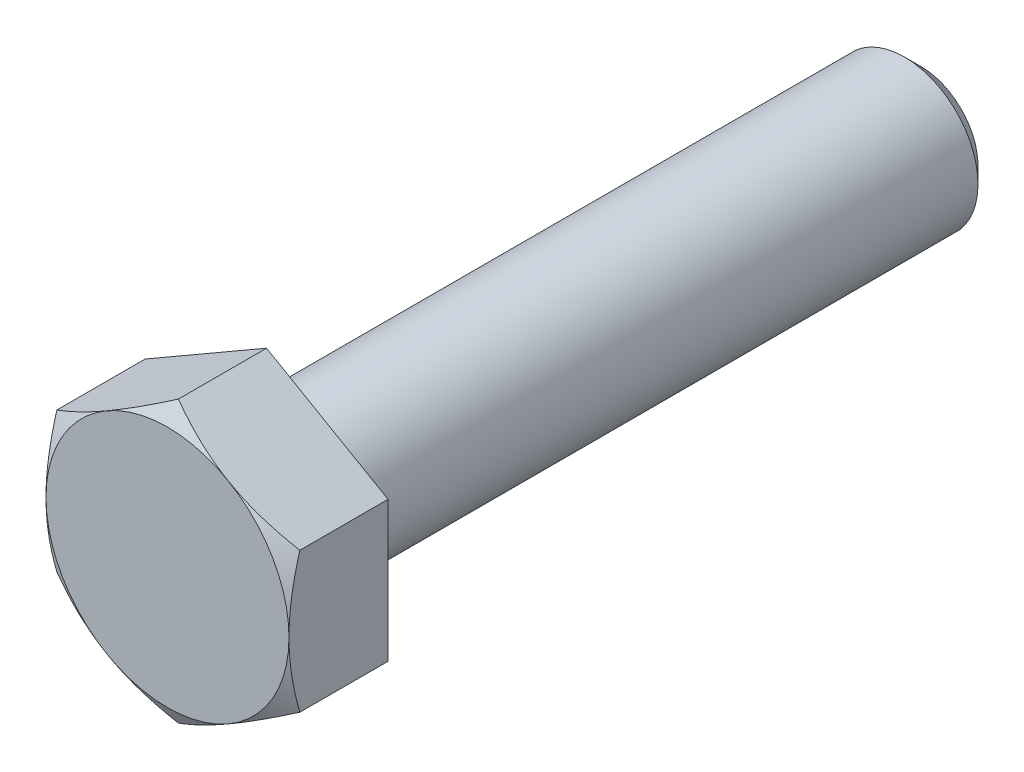
ISO-10303-21;
HEADER;
FILE_DESCRIPTION(('STEP AP214'),'2;1');
FILE_NAME('part.step','',(''),(''),'','','');
FILE_SCHEMA(('AUTOMOTIVE_DESIGN { 1 0 10303 214 1 1 1 1 }'));
ENDSEC;
DATA;
#1=APPLICATION_CONTEXT('core data for automotive mechanical design processes');
#2=APPLICATION_PROTOCOL_DEFINITION('international standard','automotive_design',2000,#1);
#3=PRODUCT_CONTEXT('',#1,'mechanical');
#4=PRODUCT('Part','Part','',(#3));
#5=PRODUCT_RELATED_PRODUCT_CATEGORY('part','',(#4));
#6=PRODUCT_DEFINITION_FORMATION('','',#4);
#7=PRODUCT_DEFINITION_CONTEXT('part definition',#1,'design');
#8=PRODUCT_DEFINITION('design','',#6,#7);
#9=PRODUCT_DEFINITION_SHAPE('','',#8);
#10=(LENGTH_UNIT() NAMED_UNIT(*) SI_UNIT(.MILLI.,.METRE.));
#11=(NAMED_UNIT(*) PLANE_ANGLE_UNIT() SI_UNIT($,.RADIAN.));
#12=(NAMED_UNIT(*) SI_UNIT($,.STERADIAN.) SOLID_ANGLE_UNIT());
#13=UNCERTAINTY_MEASURE_WITH_UNIT(LENGTH_MEASURE(1.E-05),#10,'distance_accuracy_value','');
#14=(GEOMETRIC_REPRESENTATION_CONTEXT(3) GLOBAL_UNCERTAINTY_ASSIGNED_CONTEXT((#13)) GLOBAL_UNIT_ASSIGNED_CONTEXT((#10,
#11,#12)) REPRESENTATION_CONTEXT('',''));
#15=CARTESIAN_POINT('',(0.,0.,0.));
#16=DIRECTION('',(0.,0.,1.));
#17=DIRECTION('',(1.,0.,0.));
#18=AXIS2_PLACEMENT_3D('',#15,#16,#17);
#19=CARTESIAN_POINT('',(-6.5,-3.75277674973257,5.3));
#20=DIRECTION('',(0.,0.,1.));
#21=DIRECTION('',(1.,0.,0.));
#22=AXIS2_PLACEMENT_3D('',#19,#20,#21);
#23=PLANE('',#22);
#24=CARTESIAN_POINT('',(0.,0.,5.3));
#25=DIRECTION('',(0.,0.,1.));
#26=DIRECTION('',(1.,0.,0.));
#27=AXIS2_PLACEMENT_3D('',#24,#25,#26);
#28=CIRCLE('',#27,6.5);
#29=CARTESIAN_POINT('',(3.25,-5.62916512459885,5.3));
#30=VERTEX_POINT('',#29);
#31=CARTESIAN_POINT('',(6.5,0.,5.3));
#32=VERTEX_POINT('',#31);
#33=EDGE_CURVE('E195',#30,#32,#28,.T.);
#34=ORIENTED_EDGE('',*,*,#33,.T.);
#35=CARTESIAN_POINT('',(0.,0.,5.3));
#36=DIRECTION('',(0.,0.,1.));
#37=DIRECTION('',(1.,0.,0.));
#38=AXIS2_PLACEMENT_3D('',#35,#36,#37);
#39=CIRCLE('',#38,6.5);
#40=CARTESIAN_POINT('',(3.25,5.62916512459885,5.3));
#41=VERTEX_POINT('',#40);
#42=EDGE_CURVE('E11',#32,#41,#39,.T.);
#43=ORIENTED_EDGE('',*,*,#42,.T.);
#44=CARTESIAN_POINT('',(0.,0.,5.3));
#45=DIRECTION('',(0.,0.,1.));
#46=DIRECTION('',(1.,0.,0.));
#47=AXIS2_PLACEMENT_3D('',#44,#45,#46);
#48=CIRCLE('',#47,6.5);
#49=CARTESIAN_POINT('',(-3.25,5.62916512459885,5.3));
#50=VERTEX_POINT('',#49);
#51=EDGE_CURVE('E28',#41,#50,#48,.T.);
#52=ORIENTED_EDGE('',*,*,#51,.T.);
#53=CARTESIAN_POINT('',(0.,0.,5.3));
#54=DIRECTION('',(0.,0.,1.));
#55=DIRECTION('',(1.,0.,0.));
#56=AXIS2_PLACEMENT_3D('',#53,#54,#55);
#57=CIRCLE('',#56,6.5);
#58=CARTESIAN_POINT('',(-6.5,0.,5.3));
#59=VERTEX_POINT('',#58);
#60=EDGE_CURVE('E166',#50,#59,#57,.T.);
#61=ORIENTED_EDGE('',*,*,#60,.T.);
#62=CARTESIAN_POINT('',(0.,0.,5.3));
#63=DIRECTION('',(0.,0.,1.));
#64=DIRECTION('',(1.,0.,0.));
#65=AXIS2_PLACEMENT_3D('',#62,#63,#64);
#66=CIRCLE('',#65,6.5);
#67=CARTESIAN_POINT('',(-3.25,-5.62916512459885,5.3));
#68=VERTEX_POINT('',#67);
#69=EDGE_CURVE('E140',#59,#68,#66,.T.);
#70=ORIENTED_EDGE('',*,*,#69,.T.);
#71=CARTESIAN_POINT('',(0.,0.,5.3));
#72=DIRECTION('',(0.,0.,1.));
#73=DIRECTION('',(1.,0.,0.));
#74=AXIS2_PLACEMENT_3D('',#71,#72,#73);
#75=CIRCLE('',#74,6.5);
#76=EDGE_CURVE('E167',#68,#30,#75,.T.);
#77=ORIENTED_EDGE('',*,*,#76,.T.);
#78=EDGE_LOOP('',(#34,#43,#52,#61,#70,#77));
#79=FACE_BOUND('',#78,.T.);
#80=ADVANCED_FACE('F17',(#79),#23,.T.);
#81=CARTESIAN_POINT('',(0.,0.,5.3));
#82=DIRECTION('',(0.,0.,-1.));
#83=DIRECTION('',(1.,0.,0.));
#84=AXIS2_PLACEMENT_3D('',#81,#82,#83);
#85=CONICAL_SURFACE('',#84,6.5,1.0471975511966);
#86=CARTESIAN_POINT('',(6.5,0.,5.30000000000001));
#87=CARTESIAN_POINT('',(6.49999999999998,1.74166975080559,5.30000000000001));
#88=CARTESIAN_POINT('',(6.49999999999999,3.75277674974074,4.71944341639689));
#89=(BOUNDED_CURVE() B_SPLINE_CURVE(2,(#86,#87,#88),.UNSPECIFIED.,.F.,
.F.) B_SPLINE_CURVE_WITH_KNOTS((3,3),(1.73382513864546,2.42154946226623),
.UNSPECIFIED.) CURVE() GEOMETRIC_REPRESENTATION_ITEM() RATIONAL_B_SPLINE_CURVE((1.83937846828339,
1.83937846828338,1.70731703595936)) REPRESENTATION_ITEM(''));
#90=CARTESIAN_POINT('',(6.5,3.75277674973257,4.71944341639925));
#91=VERTEX_POINT('',#90);
#92=EDGE_CURVE('E180',#32,#91,#89,.T.);
#93=ORIENTED_EDGE('',*,*,#92,.T.);
#94=CARTESIAN_POINT('',(6.50000000000708,3.75277674972847,4.71944341639688));
#95=CARTESIAN_POINT('',(4.75833024920054,4.75833024919606,5.3));
#96=CARTESIAN_POINT('',(3.24999999999999,5.62916512459884,5.3));
#97=(BOUNDED_CURVE() B_SPLINE_CURVE(2,(#94,#95,#96),.UNSPECIFIED.,.F.,
.F.) B_SPLINE_CURVE_WITH_KNOTS((3,3),(1.04610081502468,1.73382513864545),
.UNSPECIFIED.) CURVE() GEOMETRIC_REPRESENTATION_ITEM() RATIONAL_B_SPLINE_CURVE((1.70731703595936,
1.83937846828339,1.83937846828339)) REPRESENTATION_ITEM(''));
#98=EDGE_CURVE('E186',#91,#41,#97,.T.);
#99=ORIENTED_EDGE('',*,*,#98,.T.);
#100=ORIENTED_EDGE('',*,*,#42,.F.);
#101=EDGE_LOOP('',(#93,#99,#100));
#102=FACE_BOUND('',#101,.T.);
#103=ADVANCED_FACE('F350',(#102),#85,.T.);
#104=CARTESIAN_POINT('',(0.,0.,5.3));
#105=DIRECTION('',(0.,0.,-1.));
#106=DIRECTION('',(1.,0.,0.));
#107=AXIS2_PLACEMENT_3D('',#104,#105,#106);
#108=CONICAL_SURFACE('',#107,6.5,1.0471975511966);
#109=CARTESIAN_POINT('',(3.24999999999999,5.62916512459884,5.3));
#110=CARTESIAN_POINT('',(1.74166975079944,6.50000000000163,5.3));
#111=CARTESIAN_POINT('',(-7.09578443226996E-12,7.50555349946923,4.71944341639687));
#112=(BOUNDED_CURVE() B_SPLINE_CURVE(2,(#109,#110,#111),.UNSPECIFIED.,.F.,
.F.) B_SPLINE_CURVE_WITH_KNOTS((3,3),(1.73382513864545,2.42154946226623),
.UNSPECIFIED.) CURVE() GEOMETRIC_REPRESENTATION_ITEM() RATIONAL_B_SPLINE_CURVE((1.83937846828338,
1.83937846828339,1.70731703595936)) REPRESENTATION_ITEM(''));
#113=CARTESIAN_POINT('',(0.,7.50555349946513,4.71944341639924));
#114=VERTEX_POINT('',#113);
#115=EDGE_CURVE('E197',#41,#114,#112,.T.);
#116=ORIENTED_EDGE('',*,*,#115,.T.);
#117=CARTESIAN_POINT('',(7.08459972806953E-12,7.50555349946923,4.71944341639687));
#118=CARTESIAN_POINT('',(-1.74166975079946,6.50000000000165,5.3));
#119=CARTESIAN_POINT('',(-3.25000000000001,5.62916512459884,5.29999999999999));
#120=(BOUNDED_CURVE() B_SPLINE_CURVE(2,(#117,#118,#119),.UNSPECIFIED.,.F.,
.F.) B_SPLINE_CURVE_WITH_KNOTS((3,3),(1.04610081502468,1.73382513864545),
.UNSPECIFIED.) CURVE() GEOMETRIC_REPRESENTATION_ITEM() RATIONAL_B_SPLINE_CURVE((1.70731703595936,
1.83937846828338,1.83937846828338)) REPRESENTATION_ITEM(''));
#121=EDGE_CURVE('E196',#114,#50,#120,.T.);
#122=ORIENTED_EDGE('',*,*,#121,.T.);
#123=ORIENTED_EDGE('',*,*,#51,.F.);
#124=EDGE_LOOP('',(#116,#122,#123));
#125=FACE_BOUND('',#124,.T.);
#126=ADVANCED_FACE('F354',(#125),#108,.T.);
#127=CARTESIAN_POINT('',(0.,0.,5.3));
#128=DIRECTION('',(0.,0.,-1.));
#129=DIRECTION('',(1.,0.,0.));
#130=AXIS2_PLACEMENT_3D('',#127,#128,#129);
#131=CONICAL_SURFACE('',#130,6.5,1.0471975511966);
#132=CARTESIAN_POINT('',(-6.50000000000002,3.75277674974076,4.71944341639685));
#133=CARTESIAN_POINT('',(-6.50000000000002,1.74166975080558,5.29999999999998));
#134=CARTESIAN_POINT('',(-6.50000000000002,0.,5.29999999999998));
#135=(BOUNDED_CURVE() B_SPLINE_CURVE(2,(#132,#133,#134),.UNSPECIFIED.,.F.,
.F.) B_SPLINE_CURVE_WITH_KNOTS((3,3),(1.04610081502468,1.73382513864546),
.UNSPECIFIED.) CURVE() GEOMETRIC_REPRESENTATION_ITEM() RATIONAL_B_SPLINE_CURVE((1.70731703595935,
1.83937846828338,1.83937846828338)) REPRESENTATION_ITEM(''));
#136=CARTESIAN_POINT('',(-6.5,3.75277674973256,4.71944341639923));
#137=VERTEX_POINT('',#136);
#138=EDGE_CURVE('E155',#137,#59,#135,.T.);
#139=ORIENTED_EDGE('',*,*,#138,.T.);
#140=ORIENTED_EDGE('',*,*,#60,.F.);
#141=CARTESIAN_POINT('',(-3.25000000000001,5.62916512459884,5.29999999999999));
#142=CARTESIAN_POINT('',(-4.75833024920056,4.75833024919605,5.29999999999999));
#143=CARTESIAN_POINT('',(-6.50000000000711,3.75277674972847,4.71944341639686));
#144=(BOUNDED_CURVE() B_SPLINE_CURVE(2,(#141,#142,#143),.UNSPECIFIED.,.F.,
.F.) B_SPLINE_CURVE_WITH_KNOTS((3,3),(1.73382513864545,2.42154946226623),
.UNSPECIFIED.) CURVE() GEOMETRIC_REPRESENTATION_ITEM() RATIONAL_B_SPLINE_CURVE((1.83937846828338,
1.83937846828338,1.70731703595936)) REPRESENTATION_ITEM(''));
#145=EDGE_CURVE('E99',#50,#137,#144,.T.);
#146=ORIENTED_EDGE('',*,*,#145,.T.);
#147=EDGE_LOOP('',(#139,#140,#146));
#148=FACE_BOUND('',#147,.T.);
#149=ADVANCED_FACE('F365',(#148),#131,.T.);
#150=CARTESIAN_POINT('',(0.,0.,5.3));
#151=DIRECTION('',(0.,0.,-1.));
#152=DIRECTION('',(1.,0.,0.));
#153=AXIS2_PLACEMENT_3D('',#150,#151,#152);
#154=CONICAL_SURFACE('',#153,6.5,1.0471975511966);
#155=CARTESIAN_POINT('',(-6.50000000000002,0.,5.29999999999998));
#156=CARTESIAN_POINT('',(-6.50000000000002,-1.74166975080559,5.29999999999998));
#157=CARTESIAN_POINT('',(-6.50000000000002,-3.75277674974076,4.71944341639686));
#158=(BOUNDED_CURVE() B_SPLINE_CURVE(2,(#155,#156,#157),.UNSPECIFIED.,.F.,
.F.) B_SPLINE_CURVE_WITH_KNOTS((3,3),(1.73382513864546,2.42154946226623),
.UNSPECIFIED.) CURVE() GEOMETRIC_REPRESENTATION_ITEM() RATIONAL_B_SPLINE_CURVE((1.83937846828338,
1.83937846828338,1.70731703595935)) REPRESENTATION_ITEM(''));
#159=CARTESIAN_POINT('',(-6.5,-3.75277674973257,4.71944341639922));
#160=VERTEX_POINT('',#159);
#161=EDGE_CURVE('E136',#59,#160,#158,.T.);
#162=ORIENTED_EDGE('',*,*,#161,.T.);
#163=CARTESIAN_POINT('',(-6.50000000000711,-3.75277674972847,4.71944341639686));
#164=CARTESIAN_POINT('',(-4.75833024920057,-4.75833024919606,5.29999999999999));
#165=CARTESIAN_POINT('',(-3.25000000000001,-5.62916512459884,5.29999999999999));
#166=(BOUNDED_CURVE() B_SPLINE_CURVE(2,(#163,#164,#165),.UNSPECIFIED.,.F.,
.F.) B_SPLINE_CURVE_WITH_KNOTS((3,3),(1.04610081502468,1.73382513864545),
.UNSPECIFIED.) CURVE() GEOMETRIC_REPRESENTATION_ITEM() RATIONAL_B_SPLINE_CURVE((1.70731703595936,
1.83937846828338,1.83937846828338)) REPRESENTATION_ITEM(''));
#167=EDGE_CURVE('E126',#160,#68,#166,.T.);
#168=ORIENTED_EDGE('',*,*,#167,.T.);
#169=ORIENTED_EDGE('',*,*,#69,.F.);
#170=EDGE_LOOP('',(#162,#168,#169));
#171=FACE_BOUND('',#170,.T.);
#172=ADVANCED_FACE('F139',(#171),#154,.T.);
#173=CARTESIAN_POINT('',(0.,0.,5.3));
#174=DIRECTION('',(0.,0.,-1.));
#175=DIRECTION('',(1.,0.,0.));
#176=AXIS2_PLACEMENT_3D('',#173,#174,#175);
#177=CONICAL_SURFACE('',#176,6.5,1.0471975511966);
#178=CARTESIAN_POINT('',(-3.25000000000001,-5.62916512459884,5.29999999999999));
#179=CARTESIAN_POINT('',(-1.74166975079946,-6.50000000000163,5.3));
#180=CARTESIAN_POINT('',(7.07731666486926E-12,-7.50555349946923,4.71944341639687));
#181=(BOUNDED_CURVE() B_SPLINE_CURVE(2,(#178,#179,#180),.UNSPECIFIED.,.F.,
.F.) B_SPLINE_CURVE_WITH_KNOTS((3,3),(1.73382513864545,2.42154946226623),
.UNSPECIFIED.) CURVE() GEOMETRIC_REPRESENTATION_ITEM() RATIONAL_B_SPLINE_CURVE((1.83937846828338,
1.83937846828339,1.70731703595936)) REPRESENTATION_ITEM(''));
#182=CARTESIAN_POINT('',(0.,-7.50555349946514,4.71944341639924));
#183=VERTEX_POINT('',#182);
#184=EDGE_CURVE('E132',#68,#183,#181,.T.);
#185=ORIENTED_EDGE('',*,*,#184,.T.);
#186=CARTESIAN_POINT('',(-7.10358771427027E-12,-7.50555349946924,4.71944341639687));
#187=CARTESIAN_POINT('',(1.74166975079945,-6.50000000000163,5.3));
#188=CARTESIAN_POINT('',(3.25000000000001,-5.62916512459884,5.3));
#189=(BOUNDED_CURVE() B_SPLINE_CURVE(2,(#186,#187,#188),.UNSPECIFIED.,.F.,
.F.) B_SPLINE_CURVE_WITH_KNOTS((3,3),(1.04610081502468,1.73382513864546),
.UNSPECIFIED.) CURVE() GEOMETRIC_REPRESENTATION_ITEM() RATIONAL_B_SPLINE_CURVE((1.70731703595936,
1.83937846828339,1.83937846828339)) REPRESENTATION_ITEM(''));
#190=EDGE_CURVE('E226',#183,#30,#189,.T.);
#191=ORIENTED_EDGE('',*,*,#190,.T.);
#192=ORIENTED_EDGE('',*,*,#76,.F.);
#193=EDGE_LOOP('',(#185,#191,#192));
#194=FACE_BOUND('',#193,.T.);
#195=ADVANCED_FACE('F346',(#194),#177,.T.);
#196=CARTESIAN_POINT('',(0.,0.,5.3));
#197=DIRECTION('',(0.,0.,-1.));
#198=DIRECTION('',(1.,0.,0.));
#199=AXIS2_PLACEMENT_3D('',#196,#197,#198);
#200=CONICAL_SURFACE('',#199,6.5,1.0471975511966);
#201=CARTESIAN_POINT('',(3.25000000000001,-5.62916512459884,5.3));
#202=CARTESIAN_POINT('',(4.75833024920049,-4.75833024919609,5.3));
#203=CARTESIAN_POINT('',(6.50000000000693,-3.75277674972857,4.71944341639693));
#204=(BOUNDED_CURVE() B_SPLINE_CURVE(2,(#201,#202,#203),.UNSPECIFIED.,.F.,
.F.) B_SPLINE_CURVE_WITH_KNOTS((3,3),(1.73382513864546,2.4215494622662),
.UNSPECIFIED.) CURVE() GEOMETRIC_REPRESENTATION_ITEM() RATIONAL_B_SPLINE_CURVE((1.83937846828339,
1.83937846828338,1.70731703595937)) REPRESENTATION_ITEM(''));
#205=CARTESIAN_POINT('',(6.5,-3.75277674973285,4.71944341639943));
#206=VERTEX_POINT('',#205);
#207=EDGE_CURVE('E225',#30,#206,#204,.T.);
#208=ORIENTED_EDGE('',*,*,#207,.T.);
#209=CARTESIAN_POINT('',(6.49999999999999,-3.75277674974098,4.71944341639682));
#210=CARTESIAN_POINT('',(6.49999999999999,-1.74166975080567,5.30000000000001));
#211=CARTESIAN_POINT('',(6.5,0.,5.30000000000001));
#212=(BOUNDED_CURVE() B_SPLINE_CURVE(2,(#209,#210,#211),.UNSPECIFIED.,.F.,
.F.) B_SPLINE_CURVE_WITH_KNOTS((3,3),(1.04610081502464,1.73382513864546),
.UNSPECIFIED.) CURVE() GEOMETRIC_REPRESENTATION_ITEM() RATIONAL_B_SPLINE_CURVE((1.70731703595934,
1.83937846828339,1.83937846828339)) REPRESENTATION_ITEM(''));
#213=EDGE_CURVE('E242',#206,#32,#212,.T.);
#214=ORIENTED_EDGE('',*,*,#213,.T.);
#215=ORIENTED_EDGE('',*,*,#33,.F.);
#216=EDGE_LOOP('',(#208,#214,#215));
#217=FACE_BOUND('',#216,.T.);
#218=ADVANCED_FACE('F336',(#217),#200,.T.);
#219=CARTESIAN_POINT('',(0.,0.,-35.));
#220=DIRECTION('',(0.,0.,-1.));
#221=DIRECTION('',(0.,-1.,0.));
#222=AXIS2_PLACEMENT_3D('',#219,#220,#221);
#223=PLANE('',#222);
#224=CARTESIAN_POINT('',(0.,0.,-35.));
#225=DIRECTION('',(0.,0.,-1.));
#226=DIRECTION('',(1.,0.,0.));
#227=AXIS2_PLACEMENT_3D('',#224,#225,#226);
#228=CIRCLE('',#227,3.06250000000005);
#229=CARTESIAN_POINT('',(-3.06250000000005,0.,-35.));
#230=VERTEX_POINT('',#229);
#231=EDGE_CURVE('E173',#230,#230,#228,.T.);
#232=ORIENTED_EDGE('',*,*,#231,.T.);
#233=EDGE_LOOP('',(#232));
#234=FACE_BOUND('',#233,.T.);
#235=ADVANCED_FACE('F333',(#234),#223,.T.);
#236=CARTESIAN_POINT('',(0.,7.50555349946513,5.3));
#237=DIRECTION('',(0.5,-0.866025403784439,0.));
#238=DIRECTION('',(0.,0.,-1.));
#239=AXIS2_PLACEMENT_3D('',#236,#237,#238);
#240=PLANE('',#239);
#241=ORIENTED_EDGE('',*,*,#121,.F.);
#242=DIRECTION('',(0.,0.,-1.));
#243=VECTOR('',#242,1.);
#244=CARTESIAN_POINT('',(0.,7.50555349946513,5.3));
#245=LINE('',#244,#243);
#246=CARTESIAN_POINT('',(0.,7.50555349946513,0.));
#247=VERTEX_POINT('',#246);
#248=EDGE_CURVE('E205',#114,#247,#245,.T.);
#249=ORIENTED_EDGE('',*,*,#248,.T.);
#250=DIRECTION('',(-0.866025403784439,-0.5,0.));
#251=VECTOR('',#250,1.);
#252=CARTESIAN_POINT('',(0.,7.50555349946513,0.));
#253=LINE('',#252,#251);
#254=CARTESIAN_POINT('',(-6.5,3.75277674973256,0.));
#255=VERTEX_POINT('',#254);
#256=EDGE_CURVE('E250',#247,#255,#253,.T.);
#257=ORIENTED_EDGE('',*,*,#256,.T.);
#258=DIRECTION('',(0.,0.,-1.));
#259=VECTOR('',#258,1.);
#260=CARTESIAN_POINT('',(-6.5,3.75277674973256,5.3));
#261=LINE('',#260,#259);
#262=EDGE_CURVE('E150',#137,#255,#261,.T.);
#263=ORIENTED_EDGE('',*,*,#262,.F.);
#264=ORIENTED_EDGE('',*,*,#145,.F.);
#265=EDGE_LOOP('',(#241,#249,#257,#263,#264));
#266=FACE_BOUND('',#265,.T.);
#267=ADVANCED_FACE('F335',(#266),#240,.F.);
#268=CARTESIAN_POINT('',(6.5,3.75277674973257,5.3));
#269=DIRECTION('',(-0.5,-0.866025403784439,0.));
#270=DIRECTION('',(-0.866025403784439,0.5,0.));
#271=AXIS2_PLACEMENT_3D('',#268,#269,#270);
#272=PLANE('',#271);
#273=ORIENTED_EDGE('',*,*,#98,.F.);
#274=DIRECTION('',(0.,0.,-1.));
#275=VECTOR('',#274,1.);
#276=CARTESIAN_POINT('',(6.5,3.75277674973257,5.3));
#277=LINE('',#276,#275);
#278=CARTESIAN_POINT('',(6.5,3.75277674973257,0.));
#279=VERTEX_POINT('',#278);
#280=EDGE_CURVE('E187',#91,#279,#277,.T.);
#281=ORIENTED_EDGE('',*,*,#280,.T.);
#282=DIRECTION('',(-0.866025403784439,0.5,0.));
#283=VECTOR('',#282,1.);
#284=CARTESIAN_POINT('',(6.5,3.75277674973257,0.));
#285=LINE('',#284,#283);
#286=EDGE_CURVE('E274',#279,#247,#285,.T.);
#287=ORIENTED_EDGE('',*,*,#286,.T.);
#288=ORIENTED_EDGE('',*,*,#248,.F.);
#289=ORIENTED_EDGE('',*,*,#115,.F.);
#290=EDGE_LOOP('',(#273,#281,#287,#288,#289));
#291=FACE_BOUND('',#290,.T.);
#292=ADVANCED_FACE('F343',(#291),#272,.F.);
#293=CARTESIAN_POINT('',(6.5,-3.75277674973257,5.3));
#294=DIRECTION('',(-1.,0.,0.));
#295=DIRECTION('',(0.,0.,1.));
#296=AXIS2_PLACEMENT_3D('',#293,#294,#295);
#297=PLANE('',#296);
#298=ORIENTED_EDGE('',*,*,#213,.F.);
#299=DIRECTION('',(0.,0.,-1.));
#300=VECTOR('',#299,1.);
#301=CARTESIAN_POINT('',(6.5,-3.75277674973257,5.3));
#302=LINE('',#301,#300);
#303=CARTESIAN_POINT('',(6.5,-3.75277674973257,0.));
#304=VERTEX_POINT('',#303);
#305=EDGE_CURVE('E223',#206,#304,#302,.T.);
#306=ORIENTED_EDGE('',*,*,#305,.T.);
#307=DIRECTION('',(0.,1.,0.));
#308=VECTOR('',#307,1.);
#309=CARTESIAN_POINT('',(6.5,-3.75277674973257,0.));
#310=LINE('',#309,#308);
#311=EDGE_CURVE('E262',#304,#279,#310,.T.);
#312=ORIENTED_EDGE('',*,*,#311,.T.);
#313=ORIENTED_EDGE('',*,*,#280,.F.);
#314=ORIENTED_EDGE('',*,*,#92,.F.);
#315=EDGE_LOOP('',(#298,#306,#312,#313,#314));
#316=FACE_BOUND('',#315,.T.);
#317=ADVANCED_FACE('F363',(#316),#297,.F.);
#318=CARTESIAN_POINT('',(0.,-7.50555349946514,5.3));
#319=DIRECTION('',(-0.5,0.866025403784439,0.));
#320=DIRECTION('',(0.,0.,1.));
#321=AXIS2_PLACEMENT_3D('',#318,#319,#320);
#322=PLANE('',#321);
#323=ORIENTED_EDGE('',*,*,#190,.F.);
#324=DIRECTION('',(0.,0.,-1.));
#325=VECTOR('',#324,1.);
#326=CARTESIAN_POINT('',(0.,-7.50555349946514,5.3));
#327=LINE('',#326,#325);
#328=CARTESIAN_POINT('',(0.,-7.50555349946514,0.));
#329=VERTEX_POINT('',#328);
#330=EDGE_CURVE('E111',#183,#329,#327,.T.);
#331=ORIENTED_EDGE('',*,*,#330,.T.);
#332=DIRECTION('',(0.866025403784439,0.5,0.));
#333=VECTOR('',#332,1.);
#334=CARTESIAN_POINT('',(0.,-7.50555349946514,0.));
#335=LINE('',#334,#333);
#336=EDGE_CURVE('E256',#329,#304,#335,.T.);
#337=ORIENTED_EDGE('',*,*,#336,.T.);
#338=ORIENTED_EDGE('',*,*,#305,.F.);
#339=ORIENTED_EDGE('',*,*,#207,.F.);
#340=EDGE_LOOP('',(#323,#331,#337,#338,#339));
#341=FACE_BOUND('',#340,.T.);
#342=ADVANCED_FACE('F19',(#341),#322,.F.);
#343=CARTESIAN_POINT('',(-6.5,-3.75277674973257,5.3));
#344=DIRECTION('',(0.5,0.866025403784439,0.));
#345=DIRECTION('',(0.,0.,-1.));
#346=AXIS2_PLACEMENT_3D('',#343,#344,#345);
#347=PLANE('',#346);
#348=ORIENTED_EDGE('',*,*,#167,.F.);
#349=DIRECTION('',(0.,0.,-1.));
#350=VECTOR('',#349,1.);
#351=CARTESIAN_POINT('',(-6.5,-3.75277674973257,5.3));
#352=LINE('',#351,#350);
#353=CARTESIAN_POINT('',(-6.5,-3.75277674973257,0.));
#354=VERTEX_POINT('',#353);
#355=EDGE_CURVE('E21',#160,#354,#352,.T.);
#356=ORIENTED_EDGE('',*,*,#355,.T.);
#357=DIRECTION('',(0.866025403784439,-0.5,0.));
#358=VECTOR('',#357,1.);
#359=CARTESIAN_POINT('',(-6.5,-3.75277674973257,0.));
#360=LINE('',#359,#358);
#361=EDGE_CURVE('E161',#354,#329,#360,.T.);
#362=ORIENTED_EDGE('',*,*,#361,.T.);
#363=ORIENTED_EDGE('',*,*,#330,.F.);
#364=ORIENTED_EDGE('',*,*,#184,.F.);
#365=EDGE_LOOP('',(#348,#356,#362,#363,#364));
#366=FACE_BOUND('',#365,.T.);
#367=ADVANCED_FACE('F128',(#366),#347,.F.);
#368=CARTESIAN_POINT('',(-6.5,3.75277674973256,5.3));
#369=DIRECTION('',(1.,0.,0.));
#370=DIRECTION('',(0.,0.,1.));
#371=AXIS2_PLACEMENT_3D('',#368,#369,#370);
#372=PLANE('',#371);
#373=ORIENTED_EDGE('',*,*,#138,.F.);
#374=ORIENTED_EDGE('',*,*,#262,.T.);
#375=DIRECTION('',(0.,-1.,0.));
#376=VECTOR('',#375,1.);
#377=CARTESIAN_POINT('',(-6.5,3.75277674973256,0.));
#378=LINE('',#377,#376);
#379=EDGE_CURVE('E148',#255,#354,#378,.T.);
#380=ORIENTED_EDGE('',*,*,#379,.T.);
#381=ORIENTED_EDGE('',*,*,#355,.F.);
#382=ORIENTED_EDGE('',*,*,#161,.F.);
#383=EDGE_LOOP('',(#373,#374,#380,#381,#382));
#384=FACE_BOUND('',#383,.T.);
#385=ADVANCED_FACE('F146',(#384),#372,.F.);
#386=CARTESIAN_POINT('',(-6.5,-3.75277674973257,0.));
#387=DIRECTION('',(0.,0.,1.));
#388=DIRECTION('',(1.,0.,0.));
#389=AXIS2_PLACEMENT_3D('',#386,#387,#388);
#390=PLANE('',#389);
#391=CARTESIAN_POINT('',(0.,0.,0.));
#392=DIRECTION('',(0.,0.,-1.));
#393=DIRECTION('',(-1.,0.,0.));
#394=AXIS2_PLACEMENT_3D('',#391,#392,#393);
#395=CIRCLE('',#394,3.933);
#396=CARTESIAN_POINT('',(3.933,0.,0.));
#397=VERTEX_POINT('',#396);
#398=EDGE_CURVE('E178',#397,#397,#395,.T.);
#399=ORIENTED_EDGE('',*,*,#398,.F.);
#400=EDGE_LOOP('',(#399));
#401=FACE_BOUND('',#400,.T.);
#402=ORIENTED_EDGE('',*,*,#379,.F.);
#403=ORIENTED_EDGE('',*,*,#256,.F.);
#404=ORIENTED_EDGE('',*,*,#286,.F.);
#405=ORIENTED_EDGE('',*,*,#311,.F.);
#406=ORIENTED_EDGE('',*,*,#336,.F.);
#407=ORIENTED_EDGE('',*,*,#361,.F.);
#408=EDGE_LOOP('',(#402,#403,#404,#405,#406,#407));
#409=FACE_BOUND('',#408,.T.);
#410=ADVANCED_FACE('F374',(#401,#409),#390,.F.);
#411=CARTESIAN_POINT('',(0.,0.,0.));
#412=DIRECTION('',(0.,0.,-1.));
#413=DIRECTION('',(-1.,0.,0.));
#414=AXIS2_PLACEMENT_3D('',#411,#412,#413);
#415=CYLINDRICAL_SURFACE('',#414,3.933);
#416=CARTESIAN_POINT('',(0.,0.,-34.1295));
#417=DIRECTION('',(0.,0.,1.));
#418=DIRECTION('',(-1.,0.,0.));
#419=AXIS2_PLACEMENT_3D('',#416,#417,#418);
#420=CIRCLE('',#419,3.933);
#421=CARTESIAN_POINT('',(3.93300000000006,0.,-34.1295));
#422=VERTEX_POINT('',#421);
#423=CARTESIAN_POINT('',(-3.933,0.,-34.1295));
#424=VERTEX_POINT('',#423);
#425=EDGE_CURVE('E172',#422,#424,#420,.T.);
#426=ORIENTED_EDGE('',*,*,#425,.T.);
#427=CARTESIAN_POINT('',(0.,0.,-34.1295));
#428=DIRECTION('',(0.,0.,1.));
#429=DIRECTION('',(-1.,0.,0.));
#430=AXIS2_PLACEMENT_3D('',#427,#428,#429);
#431=CIRCLE('',#430,3.933);
#432=EDGE_CURVE('E179',#424,#422,#431,.T.);
#433=ORIENTED_EDGE('',*,*,#432,.T.);
#434=DIRECTION('',(0.,0.,1.));
#435=VECTOR('',#434,1.);
#436=CARTESIAN_POINT('',(3.933,0.,0.));
#437=LINE('',#436,#435);
#438=EDGE_CURVE('E174',#422,#397,#437,.T.);
#439=ORIENTED_EDGE('',*,*,#438,.T.);
#440=ORIENTED_EDGE('',*,*,#398,.T.);
#441=ORIENTED_EDGE('',*,*,#438,.F.);
#442=EDGE_LOOP('',(#426,#433,#439,#440,#441));
#443=FACE_BOUND('',#442,.T.);
#444=ADVANCED_FACE('F325',(#443),#415,.T.);
#445=CARTESIAN_POINT('',(0.,0.,-34.53125));
#446=DIRECTION('',(0.,0.,1.));
#447=DIRECTION('',(1.,0.,0.));
#448=AXIS2_PLACEMENT_3D('',#445,#446,#447);
#449=CONICAL_SURFACE('',#448,3.53125000000006,0.785398163397443);
#450=ORIENTED_EDGE('',*,*,#231,.F.);
#451=DIRECTION('',(-0.707106781186544,0.,0.707106781186551));
#452=VECTOR('',#451,1.);
#453=CARTESIAN_POINT('',(-3.53125000000006,0.,-34.53125));
#454=LINE('',#453,#452);
#455=EDGE_CURVE('E168',#230,#424,#454,.T.);
#456=ORIENTED_EDGE('',*,*,#455,.T.);
#457=ORIENTED_EDGE('',*,*,#425,.F.);
#458=ORIENTED_EDGE('',*,*,#432,.F.);
#459=ORIENTED_EDGE('',*,*,#455,.F.);
#460=EDGE_LOOP('',(#450,#456,#457,#458,#459));
#461=FACE_BOUND('',#460,.T.);
#462=ADVANCED_FACE('F331',(#461),#449,.T.);
#463=CLOSED_SHELL('',(#80,#103,#126,#149,#172,#195,#218,#235,#267,#292,#317,#342,#367,#385,#410,
#444,#462));
#464=MANIFOLD_SOLID_BREP('B1',#463);
#465=ADVANCED_BREP_SHAPE_REPRESENTATION('',(#18,#464),#14);
#466=SHAPE_DEFINITION_REPRESENTATION(#9,#465);
ENDSEC;
END-ISO-10303-21;
